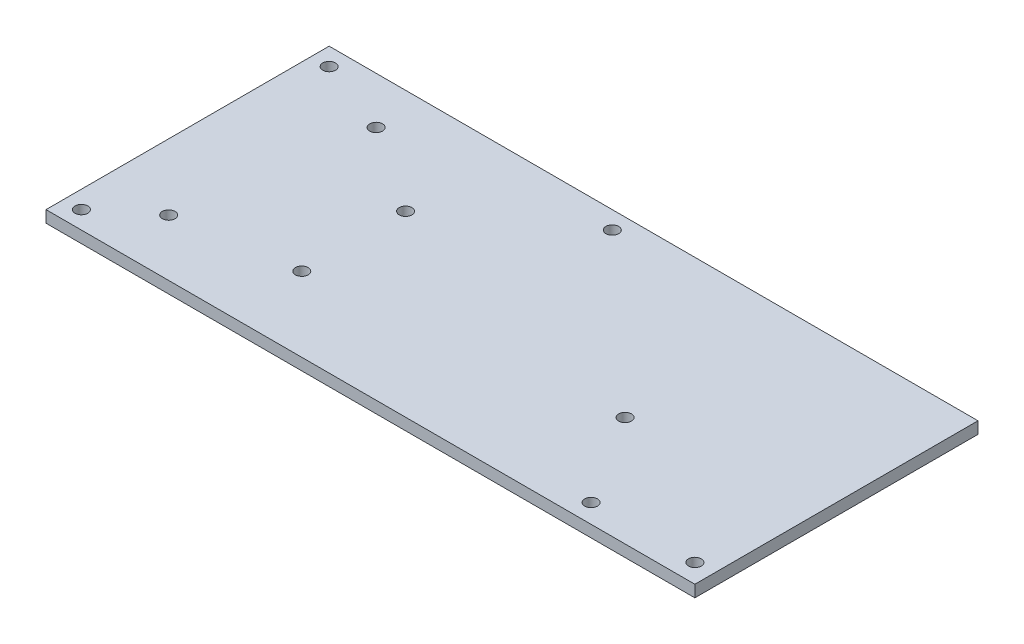
ISO-10303-21;
HEADER;
FILE_DESCRIPTION(('STEP AP214'),'2;1');
FILE_NAME('part.step','',(''),(''),'','','');
FILE_SCHEMA(('AUTOMOTIVE_DESIGN { 1 0 10303 214 1 1 1 1 }'));
ENDSEC;
DATA;
#1=APPLICATION_CONTEXT('core data for automotive mechanical design processes');
#2=APPLICATION_PROTOCOL_DEFINITION('international standard','automotive_design',2000,#1);
#3=PRODUCT_CONTEXT('',#1,'mechanical');
#4=PRODUCT('Part','Part','',(#3));
#5=PRODUCT_RELATED_PRODUCT_CATEGORY('part','',(#4));
#6=PRODUCT_DEFINITION_FORMATION('','',#4);
#7=PRODUCT_DEFINITION_CONTEXT('part definition',#1,'design');
#8=PRODUCT_DEFINITION('design','',#6,#7);
#9=PRODUCT_DEFINITION_SHAPE('','',#8);
#10=(LENGTH_UNIT() NAMED_UNIT(*) SI_UNIT(.MILLI.,.METRE.));
#11=(NAMED_UNIT(*) PLANE_ANGLE_UNIT() SI_UNIT($,.RADIAN.));
#12=(NAMED_UNIT(*) SI_UNIT($,.STERADIAN.) SOLID_ANGLE_UNIT());
#13=UNCERTAINTY_MEASURE_WITH_UNIT(LENGTH_MEASURE(1.E-05),#10,'distance_accuracy_value','');
#14=(GEOMETRIC_REPRESENTATION_CONTEXT(3) GLOBAL_UNCERTAINTY_ASSIGNED_CONTEXT((#13)) GLOBAL_UNIT_ASSIGNED_CONTEXT((#10,
#11,#12)) REPRESENTATION_CONTEXT('',''));
#15=CARTESIAN_POINT('',(0.,0.,0.));
#16=DIRECTION('',(0.,0.,1.));
#17=DIRECTION('',(1.,0.,0.));
#18=AXIS2_PLACEMENT_3D('',#15,#16,#17);
#19=CARTESIAN_POINT('',(87.3125,3.175,38.1));
#20=DIRECTION('',(-1.,0.,0.));
#21=DIRECTION('',(0.,0.,1.));
#22=AXIS2_PLACEMENT_3D('',#19,#20,#21);
#23=PLANE('',#22);
#24=DIRECTION('',(0.,0.,-1.));
#25=VECTOR('',#24,1.);
#26=CARTESIAN_POINT('',(87.3125,0.,38.1));
#27=LINE('',#26,#25);
#28=CARTESIAN_POINT('',(87.3125,0.,38.1));
#29=VERTEX_POINT('',#28);
#30=CARTESIAN_POINT('',(87.3125,0.,-38.1));
#31=VERTEX_POINT('',#30);
#32=EDGE_CURVE('E96',#29,#31,#27,.T.);
#33=ORIENTED_EDGE('',*,*,#32,.T.);
#34=DIRECTION('',(0.,-1.,0.));
#35=VECTOR('',#34,1.);
#36=CARTESIAN_POINT('',(87.3125,3.175,-38.1));
#37=LINE('',#36,#35);
#38=CARTESIAN_POINT('',(87.3125,3.175,-38.1));
#39=VERTEX_POINT('',#38);
#40=EDGE_CURVE('E11',#39,#31,#37,.T.);
#41=ORIENTED_EDGE('',*,*,#40,.F.);
#42=DIRECTION('',(0.,0.,-1.));
#43=VECTOR('',#42,1.);
#44=CARTESIAN_POINT('',(87.3125,3.175,38.1));
#45=LINE('',#44,#43);
#46=CARTESIAN_POINT('',(87.3125,3.175,38.1));
#47=VERTEX_POINT('',#46);
#48=EDGE_CURVE('E84',#47,#39,#45,.T.);
#49=ORIENTED_EDGE('',*,*,#48,.F.);
#50=DIRECTION('',(0.,-1.,0.));
#51=VECTOR('',#50,1.);
#52=CARTESIAN_POINT('',(87.3125,3.175,38.1));
#53=LINE('',#52,#51);
#54=EDGE_CURVE('E92',#47,#29,#53,.T.);
#55=ORIENTED_EDGE('',*,*,#54,.T.);
#56=EDGE_LOOP('',(#33,#41,#49,#55));
#57=FACE_BOUND('',#56,.T.);
#58=ADVANCED_FACE('F33',(#57),#23,.F.);
#59=CARTESIAN_POINT('',(-87.3125,3.175,-38.1));
#60=DIRECTION('',(0.,0.,1.));
#61=DIRECTION('',(1.,0.,0.));
#62=AXIS2_PLACEMENT_3D('',#59,#60,#61);
#63=PLANE('',#62);
#64=DIRECTION('',(-1.,0.,0.));
#65=VECTOR('',#64,1.);
#66=CARTESIAN_POINT('',(-87.3125,0.,-38.1));
#67=LINE('',#66,#65);
#68=CARTESIAN_POINT('',(-87.3125,0.,-38.1));
#69=VERTEX_POINT('',#68);
#70=EDGE_CURVE('E88',#31,#69,#67,.T.);
#71=ORIENTED_EDGE('',*,*,#70,.T.);
#72=DIRECTION('',(0.,-1.,0.));
#73=VECTOR('',#72,1.);
#74=CARTESIAN_POINT('',(-87.3125,3.175,-38.1));
#75=LINE('',#74,#73);
#76=CARTESIAN_POINT('',(-87.3125,3.175,-38.1));
#77=VERTEX_POINT('',#76);
#78=EDGE_CURVE('E41',#77,#69,#75,.T.);
#79=ORIENTED_EDGE('',*,*,#78,.F.);
#80=DIRECTION('',(-1.,0.,0.));
#81=VECTOR('',#80,1.);
#82=CARTESIAN_POINT('',(-87.3125,3.175,-38.1));
#83=LINE('',#82,#81);
#84=EDGE_CURVE('E79',#39,#77,#83,.T.);
#85=ORIENTED_EDGE('',*,*,#84,.F.);
#86=ORIENTED_EDGE('',*,*,#40,.T.);
#87=EDGE_LOOP('',(#71,#79,#85,#86));
#88=FACE_BOUND('',#87,.T.);
#89=ADVANCED_FACE('F87',(#88),#63,.F.);
#90=CARTESIAN_POINT('',(-87.3125,3.175,38.1));
#91=DIRECTION('',(1.,0.,0.));
#92=DIRECTION('',(0.,0.,-1.));
#93=AXIS2_PLACEMENT_3D('',#90,#91,#92);
#94=PLANE('',#93);
#95=DIRECTION('',(0.,0.,1.));
#96=VECTOR('',#95,1.);
#97=CARTESIAN_POINT('',(-87.3125,0.,38.1));
#98=LINE('',#97,#96);
#99=CARTESIAN_POINT('',(-87.3125,0.,38.1));
#100=VERTEX_POINT('',#99);
#101=EDGE_CURVE('E66',#69,#100,#98,.T.);
#102=ORIENTED_EDGE('',*,*,#101,.T.);
#103=DIRECTION('',(0.,-1.,0.));
#104=VECTOR('',#103,1.);
#105=CARTESIAN_POINT('',(-87.3125,3.175,38.1));
#106=LINE('',#105,#104);
#107=CARTESIAN_POINT('',(-87.3125,3.175,38.1));
#108=VERTEX_POINT('',#107);
#109=EDGE_CURVE('E89',#108,#100,#106,.T.);
#110=ORIENTED_EDGE('',*,*,#109,.F.);
#111=DIRECTION('',(0.,0.,1.));
#112=VECTOR('',#111,1.);
#113=CARTESIAN_POINT('',(-87.3125,3.175,38.1));
#114=LINE('',#113,#112);
#115=EDGE_CURVE('E82',#77,#108,#114,.T.);
#116=ORIENTED_EDGE('',*,*,#115,.F.);
#117=ORIENTED_EDGE('',*,*,#78,.T.);
#118=EDGE_LOOP('',(#102,#110,#116,#117));
#119=FACE_BOUND('',#118,.T.);
#120=ADVANCED_FACE('F90',(#119),#94,.F.);
#121=CARTESIAN_POINT('',(-87.3125,3.175,38.1));
#122=DIRECTION('',(0.,0.,-1.));
#123=DIRECTION('',(-1.,0.,0.));
#124=AXIS2_PLACEMENT_3D('',#121,#122,#123);
#125=PLANE('',#124);
#126=DIRECTION('',(1.,0.,0.));
#127=VECTOR('',#126,1.);
#128=CARTESIAN_POINT('',(-87.3125,0.,38.1));
#129=LINE('',#128,#127);
#130=EDGE_CURVE('E72',#100,#29,#129,.T.);
#131=ORIENTED_EDGE('',*,*,#130,.T.);
#132=ORIENTED_EDGE('',*,*,#54,.F.);
#133=DIRECTION('',(1.,0.,0.));
#134=VECTOR('',#133,1.);
#135=CARTESIAN_POINT('',(-87.3125,3.175,38.1));
#136=LINE('',#135,#134);
#137=EDGE_CURVE('E49',#108,#47,#136,.T.);
#138=ORIENTED_EDGE('',*,*,#137,.F.);
#139=ORIENTED_EDGE('',*,*,#109,.T.);
#140=EDGE_LOOP('',(#131,#132,#138,#139));
#141=FACE_BOUND('',#140,.T.);
#142=ADVANCED_FACE('F104',(#141),#125,.F.);
#143=CARTESIAN_POINT('',(0.,3.175,0.));
#144=DIRECTION('',(0.,-1.,0.));
#145=DIRECTION('',(0.,0.,-1.));
#146=AXIS2_PLACEMENT_3D('',#143,#144,#145);
#147=PLANE('',#146);
#148=CARTESIAN_POINT('',(39.0525,3.175,8.636));
#149=DIRECTION('',(0.,1.,0.));
#150=DIRECTION('',(0.,0.,1.));
#151=AXIS2_PLACEMENT_3D('',#148,#149,#150);
#152=CIRCLE('',#151,1.7145);
#153=CARTESIAN_POINT('',(39.0525,3.175,10.3505));
#154=VERTEX_POINT('',#153);
#155=EDGE_CURVE('E161',#154,#154,#152,.T.);
#156=ORIENTED_EDGE('',*,*,#155,.F.);
#157=EDGE_LOOP('',(#156));
#158=FACE_BOUND('',#157,.T.);
#159=CARTESIAN_POINT('',(54.2925,3.175,33.02));
#160=DIRECTION('',(0.,1.,0.));
#161=DIRECTION('',(0.,0.,1.));
#162=AXIS2_PLACEMENT_3D('',#159,#160,#161);
#163=CIRCLE('',#162,1.7145);
#164=CARTESIAN_POINT('',(54.2925,3.175,34.7345));
#165=VERTEX_POINT('',#164);
#166=EDGE_CURVE('E155',#165,#165,#163,.T.);
#167=ORIENTED_EDGE('',*,*,#166,.F.);
#168=EDGE_LOOP('',(#167));
#169=FACE_BOUND('',#168,.T.);
#170=CARTESIAN_POINT('',(82.2325,3.175,33.02));
#171=DIRECTION('',(0.,1.,0.));
#172=DIRECTION('',(0.,0.,1.));
#173=AXIS2_PLACEMENT_3D('',#170,#171,#172);
#174=CIRCLE('',#173,1.7145);
#175=CARTESIAN_POINT('',(82.2325,3.175,34.7345));
#176=VERTEX_POINT('',#175);
#177=EDGE_CURVE('E149',#176,#176,#174,.T.);
#178=ORIENTED_EDGE('',*,*,#177,.F.);
#179=EDGE_LOOP('',(#178));
#180=FACE_BOUND('',#179,.T.);
#181=CARTESIAN_POINT('',(-62.0395,3.175,-25.4762));
#182=DIRECTION('',(0.,1.,0.));
#183=DIRECTION('',(0.,0.,1.));
#184=AXIS2_PLACEMENT_3D('',#181,#182,#183);
#185=CIRCLE('',#184,1.7145);
#186=CARTESIAN_POINT('',(-62.0395,3.175,-23.7617));
#187=VERTEX_POINT('',#186);
#188=EDGE_CURVE('E143',#187,#187,#185,.T.);
#189=ORIENTED_EDGE('',*,*,#188,.F.);
#190=EDGE_LOOP('',(#189));
#191=FACE_BOUND('',#190,.T.);
#192=CARTESIAN_POINT('',(-69.5325,3.175,22.86));
#193=DIRECTION('',(0.,1.,0.));
#194=DIRECTION('',(0.,0.,1.));
#195=AXIS2_PLACEMENT_3D('',#192,#193,#194);
#196=CIRCLE('',#195,1.7145);
#197=CARTESIAN_POINT('',(-69.5325,3.175,24.5745));
#198=VERTEX_POINT('',#197);
#199=EDGE_CURVE('E137',#198,#198,#196,.T.);
#200=ORIENTED_EDGE('',*,*,#199,.F.);
#201=EDGE_LOOP('',(#200));
#202=FACE_BOUND('',#201,.T.);
#203=CARTESIAN_POINT('',(-38.5445,3.175,-9.906));
#204=DIRECTION('',(0.,1.,0.));
#205=DIRECTION('',(0.,0.,1.));
#206=AXIS2_PLACEMENT_3D('',#203,#204,#205);
#207=CIRCLE('',#206,1.7145);
#208=CARTESIAN_POINT('',(-38.5445,3.175,-8.1915));
#209=VERTEX_POINT('',#208);
#210=EDGE_CURVE('E131',#209,#209,#207,.T.);
#211=ORIENTED_EDGE('',*,*,#210,.F.);
#212=EDGE_LOOP('',(#211));
#213=FACE_BOUND('',#212,.T.);
#214=CARTESIAN_POINT('',(-38.5445,3.175,18.034));
#215=DIRECTION('',(0.,1.,0.));
#216=DIRECTION('',(0.,0.,1.));
#217=AXIS2_PLACEMENT_3D('',#214,#215,#216);
#218=CIRCLE('',#217,1.7145);
#219=CARTESIAN_POINT('',(-38.5445,3.175,19.7485));
#220=VERTEX_POINT('',#219);
#221=EDGE_CURVE('E125',#220,#220,#218,.T.);
#222=ORIENTED_EDGE('',*,*,#221,.F.);
#223=EDGE_LOOP('',(#222));
#224=FACE_BOUND('',#223,.T.);
#225=CARTESIAN_POINT('',(-6.35000000000004,3.175,-33.3375));
#226=DIRECTION('',(0.,1.,0.));
#227=DIRECTION('',(0.,0.,1.));
#228=AXIS2_PLACEMENT_3D('',#225,#226,#227);
#229=CIRCLE('',#228,1.7145);
#230=CARTESIAN_POINT('',(-6.35000000000004,3.175,-31.623));
#231=VERTEX_POINT('',#230);
#232=EDGE_CURVE('E119',#231,#231,#229,.T.);
#233=ORIENTED_EDGE('',*,*,#232,.F.);
#234=EDGE_LOOP('',(#233));
#235=FACE_BOUND('',#234,.T.);
#236=CARTESIAN_POINT('',(-82.55,3.175,33.3375));
#237=DIRECTION('',(0.,1.,0.));
#238=DIRECTION('',(0.,0.,1.));
#239=AXIS2_PLACEMENT_3D('',#236,#237,#238);
#240=CIRCLE('',#239,1.7145);
#241=CARTESIAN_POINT('',(-82.55,3.175,35.052));
#242=VERTEX_POINT('',#241);
#243=EDGE_CURVE('E113',#242,#242,#240,.T.);
#244=ORIENTED_EDGE('',*,*,#243,.F.);
#245=EDGE_LOOP('',(#244));
#246=FACE_BOUND('',#245,.T.);
#247=CARTESIAN_POINT('',(-82.55,3.175,-33.3375));
#248=DIRECTION('',(0.,1.,0.));
#249=DIRECTION('',(0.,0.,1.));
#250=AXIS2_PLACEMENT_3D('',#247,#248,#249);
#251=CIRCLE('',#250,1.7145);
#252=CARTESIAN_POINT('',(-82.55,3.175,-31.623));
#253=VERTEX_POINT('',#252);
#254=EDGE_CURVE('E99',#253,#253,#251,.T.);
#255=ORIENTED_EDGE('',*,*,#254,.F.);
#256=EDGE_LOOP('',(#255));
#257=FACE_BOUND('',#256,.T.);
#258=ORIENTED_EDGE('',*,*,#48,.T.);
#259=ORIENTED_EDGE('',*,*,#84,.T.);
#260=ORIENTED_EDGE('',*,*,#115,.T.);
#261=ORIENTED_EDGE('',*,*,#137,.T.);
#262=EDGE_LOOP('',(#258,#259,#260,#261));
#263=FACE_BOUND('',#262,.T.);
#264=ADVANCED_FACE('F80',(#158,#169,#180,#191,#202,#213,#224,#235,#246,#257,#263),#147,.F.);
#265=CARTESIAN_POINT('',(0.,0.,0.));
#266=DIRECTION('',(0.,-1.,0.));
#267=DIRECTION('',(0.,0.,-1.));
#268=AXIS2_PLACEMENT_3D('',#265,#266,#267);
#269=PLANE('',#268);
#270=CARTESIAN_POINT('',(39.0525,0.,8.636));
#271=DIRECTION('',(0.,-1.,0.));
#272=DIRECTION('',(0.,0.,-1.));
#273=AXIS2_PLACEMENT_3D('',#270,#271,#272);
#274=CIRCLE('',#273,1.7145);
#275=CARTESIAN_POINT('',(39.0525,0.,6.9215));
#276=VERTEX_POINT('',#275);
#277=EDGE_CURVE('E164',#276,#276,#274,.F.);
#278=ORIENTED_EDGE('',*,*,#277,.T.);
#279=EDGE_LOOP('',(#278));
#280=FACE_BOUND('',#279,.T.);
#281=CARTESIAN_POINT('',(54.2925,0.,33.02));
#282=DIRECTION('',(0.,-1.,0.));
#283=DIRECTION('',(0.,0.,-1.));
#284=AXIS2_PLACEMENT_3D('',#281,#282,#283);
#285=CIRCLE('',#284,1.7145);
#286=CARTESIAN_POINT('',(54.2925,0.,31.3055));
#287=VERTEX_POINT('',#286);
#288=EDGE_CURVE('E158',#287,#287,#285,.F.);
#289=ORIENTED_EDGE('',*,*,#288,.T.);
#290=EDGE_LOOP('',(#289));
#291=FACE_BOUND('',#290,.T.);
#292=CARTESIAN_POINT('',(82.2325,0.,33.02));
#293=DIRECTION('',(0.,-1.,0.));
#294=DIRECTION('',(0.,0.,-1.));
#295=AXIS2_PLACEMENT_3D('',#292,#293,#294);
#296=CIRCLE('',#295,1.7145);
#297=CARTESIAN_POINT('',(82.2325,0.,31.3055));
#298=VERTEX_POINT('',#297);
#299=EDGE_CURVE('E152',#298,#298,#296,.F.);
#300=ORIENTED_EDGE('',*,*,#299,.T.);
#301=EDGE_LOOP('',(#300));
#302=FACE_BOUND('',#301,.T.);
#303=CARTESIAN_POINT('',(-62.0395,0.,-25.4762));
#304=DIRECTION('',(0.,-1.,0.));
#305=DIRECTION('',(0.,0.,-1.));
#306=AXIS2_PLACEMENT_3D('',#303,#304,#305);
#307=CIRCLE('',#306,1.7145);
#308=CARTESIAN_POINT('',(-62.0395,0.,-27.1907));
#309=VERTEX_POINT('',#308);
#310=EDGE_CURVE('E146',#309,#309,#307,.F.);
#311=ORIENTED_EDGE('',*,*,#310,.T.);
#312=EDGE_LOOP('',(#311));
#313=FACE_BOUND('',#312,.T.);
#314=CARTESIAN_POINT('',(-69.5325,0.,22.86));
#315=DIRECTION('',(0.,-1.,0.));
#316=DIRECTION('',(0.,0.,-1.));
#317=AXIS2_PLACEMENT_3D('',#314,#315,#316);
#318=CIRCLE('',#317,1.7145);
#319=CARTESIAN_POINT('',(-69.5325,0.,21.1455));
#320=VERTEX_POINT('',#319);
#321=EDGE_CURVE('E140',#320,#320,#318,.F.);
#322=ORIENTED_EDGE('',*,*,#321,.T.);
#323=EDGE_LOOP('',(#322));
#324=FACE_BOUND('',#323,.T.);
#325=CARTESIAN_POINT('',(-38.5445,0.,-9.906));
#326=DIRECTION('',(0.,-1.,0.));
#327=DIRECTION('',(0.,0.,-1.));
#328=AXIS2_PLACEMENT_3D('',#325,#326,#327);
#329=CIRCLE('',#328,1.7145);
#330=CARTESIAN_POINT('',(-38.5445,0.,-11.6205));
#331=VERTEX_POINT('',#330);
#332=EDGE_CURVE('E134',#331,#331,#329,.F.);
#333=ORIENTED_EDGE('',*,*,#332,.T.);
#334=EDGE_LOOP('',(#333));
#335=FACE_BOUND('',#334,.T.);
#336=CARTESIAN_POINT('',(-38.5445,0.,18.034));
#337=DIRECTION('',(0.,-1.,0.));
#338=DIRECTION('',(0.,0.,-1.));
#339=AXIS2_PLACEMENT_3D('',#336,#337,#338);
#340=CIRCLE('',#339,1.7145);
#341=CARTESIAN_POINT('',(-38.5445,0.,16.3195));
#342=VERTEX_POINT('',#341);
#343=EDGE_CURVE('E128',#342,#342,#340,.F.);
#344=ORIENTED_EDGE('',*,*,#343,.T.);
#345=EDGE_LOOP('',(#344));
#346=FACE_BOUND('',#345,.T.);
#347=CARTESIAN_POINT('',(-6.35000000000004,0.,-33.3375));
#348=DIRECTION('',(0.,-1.,0.));
#349=DIRECTION('',(0.,0.,-1.));
#350=AXIS2_PLACEMENT_3D('',#347,#348,#349);
#351=CIRCLE('',#350,1.7145);
#352=CARTESIAN_POINT('',(-6.35000000000004,0.,-35.052));
#353=VERTEX_POINT('',#352);
#354=EDGE_CURVE('E122',#353,#353,#351,.F.);
#355=ORIENTED_EDGE('',*,*,#354,.T.);
#356=EDGE_LOOP('',(#355));
#357=FACE_BOUND('',#356,.T.);
#358=CARTESIAN_POINT('',(-82.55,0.,33.3375));
#359=DIRECTION('',(0.,-1.,0.));
#360=DIRECTION('',(0.,0.,-1.));
#361=AXIS2_PLACEMENT_3D('',#358,#359,#360);
#362=CIRCLE('',#361,1.7145);
#363=CARTESIAN_POINT('',(-82.55,0.,31.623));
#364=VERTEX_POINT('',#363);
#365=EDGE_CURVE('E116',#364,#364,#362,.F.);
#366=ORIENTED_EDGE('',*,*,#365,.T.);
#367=EDGE_LOOP('',(#366));
#368=FACE_BOUND('',#367,.T.);
#369=CARTESIAN_POINT('',(-82.55,0.,-33.3375));
#370=DIRECTION('',(0.,-1.,0.));
#371=DIRECTION('',(0.,0.,-1.));
#372=AXIS2_PLACEMENT_3D('',#369,#370,#371);
#373=CIRCLE('',#372,1.7145);
#374=CARTESIAN_POINT('',(-82.55,0.,-35.052));
#375=VERTEX_POINT('',#374);
#376=EDGE_CURVE('E110',#375,#375,#373,.F.);
#377=ORIENTED_EDGE('',*,*,#376,.T.);
#378=EDGE_LOOP('',(#377));
#379=FACE_BOUND('',#378,.T.);
#380=ORIENTED_EDGE('',*,*,#32,.F.);
#381=ORIENTED_EDGE('',*,*,#130,.F.);
#382=ORIENTED_EDGE('',*,*,#101,.F.);
#383=ORIENTED_EDGE('',*,*,#70,.F.);
#384=EDGE_LOOP('',(#380,#381,#382,#383));
#385=FACE_BOUND('',#384,.T.);
#386=ADVANCED_FACE('F107',(#280,#291,#302,#313,#324,#335,#346,#357,#368,#379,#385),#269,.T.);
#387=CARTESIAN_POINT('',(-82.55,-0.00100000000000013,-33.3375));
#388=DIRECTION('',(0.,1.,0.));
#389=DIRECTION('',(0.,0.,1.));
#390=AXIS2_PLACEMENT_3D('',#387,#388,#389);
#391=CYLINDRICAL_SURFACE('',#390,1.7145);
#392=ORIENTED_EDGE('',*,*,#376,.F.);
#393=EDGE_LOOP('',(#392));
#394=FACE_BOUND('',#393,.T.);
#395=ORIENTED_EDGE('',*,*,#254,.T.);
#396=EDGE_LOOP('',(#395));
#397=FACE_BOUND('',#396,.T.);
#398=ADVANCED_FACE('F193',(#394,#397),#391,.F.);
#399=CARTESIAN_POINT('',(-82.55,-0.00100000000000013,33.3375));
#400=DIRECTION('',(0.,1.,0.));
#401=DIRECTION('',(0.,0.,1.));
#402=AXIS2_PLACEMENT_3D('',#399,#400,#401);
#403=CYLINDRICAL_SURFACE('',#402,1.7145);
#404=ORIENTED_EDGE('',*,*,#365,.F.);
#405=EDGE_LOOP('',(#404));
#406=FACE_BOUND('',#405,.T.);
#407=ORIENTED_EDGE('',*,*,#243,.T.);
#408=EDGE_LOOP('',(#407));
#409=FACE_BOUND('',#408,.T.);
#410=ADVANCED_FACE('F195',(#406,#409),#403,.F.);
#411=CARTESIAN_POINT('',(-6.35000000000004,-0.00100000000000013,-33.3375));
#412=DIRECTION('',(0.,1.,0.));
#413=DIRECTION('',(0.,0.,1.));
#414=AXIS2_PLACEMENT_3D('',#411,#412,#413);
#415=CYLINDRICAL_SURFACE('',#414,1.7145);
#416=ORIENTED_EDGE('',*,*,#354,.F.);
#417=EDGE_LOOP('',(#416));
#418=FACE_BOUND('',#417,.T.);
#419=ORIENTED_EDGE('',*,*,#232,.T.);
#420=EDGE_LOOP('',(#419));
#421=FACE_BOUND('',#420,.T.);
#422=ADVANCED_FACE('F202',(#418,#421),#415,.F.);
#423=CARTESIAN_POINT('',(-38.5445,-0.00100000000000013,18.034));
#424=DIRECTION('',(0.,1.,0.));
#425=DIRECTION('',(0.,0.,1.));
#426=AXIS2_PLACEMENT_3D('',#423,#424,#425);
#427=CYLINDRICAL_SURFACE('',#426,1.7145);
#428=ORIENTED_EDGE('',*,*,#343,.F.);
#429=EDGE_LOOP('',(#428));
#430=FACE_BOUND('',#429,.T.);
#431=ORIENTED_EDGE('',*,*,#221,.T.);
#432=EDGE_LOOP('',(#431));
#433=FACE_BOUND('',#432,.T.);
#434=ADVANCED_FACE('F279',(#430,#433),#427,.F.);
#435=CARTESIAN_POINT('',(-38.5445,-0.00100000000000013,-9.906));
#436=DIRECTION('',(0.,1.,0.));
#437=DIRECTION('',(0.,0.,1.));
#438=AXIS2_PLACEMENT_3D('',#435,#436,#437);
#439=CYLINDRICAL_SURFACE('',#438,1.7145);
#440=ORIENTED_EDGE('',*,*,#332,.F.);
#441=EDGE_LOOP('',(#440));
#442=FACE_BOUND('',#441,.T.);
#443=ORIENTED_EDGE('',*,*,#210,.T.);
#444=EDGE_LOOP('',(#443));
#445=FACE_BOUND('',#444,.T.);
#446=ADVANCED_FACE('F275',(#442,#445),#439,.F.);
#447=CARTESIAN_POINT('',(-69.5325,-0.00100000000000013,22.86));
#448=DIRECTION('',(0.,1.,0.));
#449=DIRECTION('',(0.,0.,1.));
#450=AXIS2_PLACEMENT_3D('',#447,#448,#449);
#451=CYLINDRICAL_SURFACE('',#450,1.7145);
#452=ORIENTED_EDGE('',*,*,#321,.F.);
#453=EDGE_LOOP('',(#452));
#454=FACE_BOUND('',#453,.T.);
#455=ORIENTED_EDGE('',*,*,#199,.T.);
#456=EDGE_LOOP('',(#455));
#457=FACE_BOUND('',#456,.T.);
#458=ADVANCED_FACE('F271',(#454,#457),#451,.F.);
#459=CARTESIAN_POINT('',(-62.0395,-0.00100000000000013,-25.4762));
#460=DIRECTION('',(0.,1.,0.));
#461=DIRECTION('',(0.,0.,1.));
#462=AXIS2_PLACEMENT_3D('',#459,#460,#461);
#463=CYLINDRICAL_SURFACE('',#462,1.7145);
#464=ORIENTED_EDGE('',*,*,#310,.F.);
#465=EDGE_LOOP('',(#464));
#466=FACE_BOUND('',#465,.T.);
#467=ORIENTED_EDGE('',*,*,#188,.T.);
#468=EDGE_LOOP('',(#467));
#469=FACE_BOUND('',#468,.T.);
#470=ADVANCED_FACE('F243',(#466,#469),#463,.F.);
#471=CARTESIAN_POINT('',(82.2325,-0.00100000000000013,33.02));
#472=DIRECTION('',(0.,1.,0.));
#473=DIRECTION('',(0.,0.,1.));
#474=AXIS2_PLACEMENT_3D('',#471,#472,#473);
#475=CYLINDRICAL_SURFACE('',#474,1.7145);
#476=ORIENTED_EDGE('',*,*,#299,.F.);
#477=EDGE_LOOP('',(#476));
#478=FACE_BOUND('',#477,.T.);
#479=ORIENTED_EDGE('',*,*,#177,.T.);
#480=EDGE_LOOP('',(#479));
#481=FACE_BOUND('',#480,.T.);
#482=ADVANCED_FACE('F237',(#478,#481),#475,.F.);
#483=CARTESIAN_POINT('',(54.2925,-0.00100000000000013,33.02));
#484=DIRECTION('',(0.,1.,0.));
#485=DIRECTION('',(0.,0.,1.));
#486=AXIS2_PLACEMENT_3D('',#483,#484,#485);
#487=CYLINDRICAL_SURFACE('',#486,1.7145);
#488=ORIENTED_EDGE('',*,*,#288,.F.);
#489=EDGE_LOOP('',(#488));
#490=FACE_BOUND('',#489,.T.);
#491=ORIENTED_EDGE('',*,*,#166,.T.);
#492=EDGE_LOOP('',(#491));
#493=FACE_BOUND('',#492,.T.);
#494=ADVANCED_FACE('F242',(#490,#493),#487,.F.);
#495=CARTESIAN_POINT('',(39.0525,-0.00100000000000013,8.636));
#496=DIRECTION('',(0.,1.,0.));
#497=DIRECTION('',(0.,0.,1.));
#498=AXIS2_PLACEMENT_3D('',#495,#496,#497);
#499=CYLINDRICAL_SURFACE('',#498,1.7145);
#500=ORIENTED_EDGE('',*,*,#277,.F.);
#501=EDGE_LOOP('',(#500));
#502=FACE_BOUND('',#501,.T.);
#503=ORIENTED_EDGE('',*,*,#155,.T.);
#504=EDGE_LOOP('',(#503));
#505=FACE_BOUND('',#504,.T.);
#506=ADVANCED_FACE('F170',(#502,#505),#499,.F.);
#507=CLOSED_SHELL('',(#58,#89,#120,#142,#264,#386,#398,#410,#422,#434,#446,#458,#470,#482,#494,#506));
#508=MANIFOLD_SOLID_BREP('B2',#507);
#509=ADVANCED_BREP_SHAPE_REPRESENTATION('',(#18,#508),#14);
#510=SHAPE_DEFINITION_REPRESENTATION(#9,#509);
ENDSEC;
END-ISO-10303-21;
